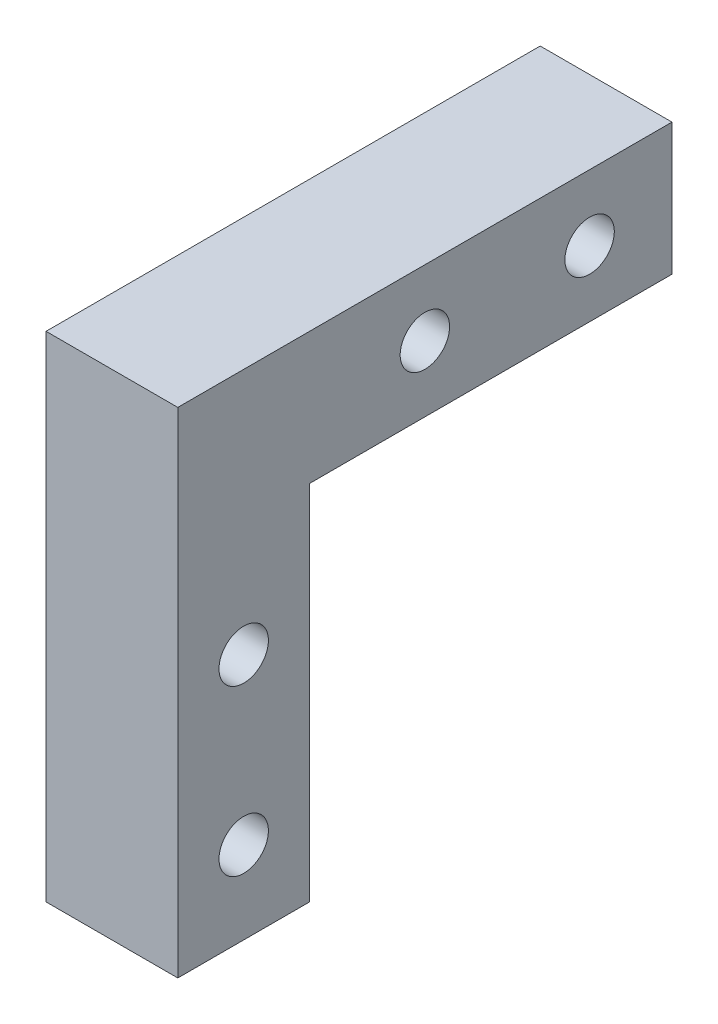
ISO-10303-21;
HEADER;
FILE_DESCRIPTION(('STEP AP214'),'2;1');
FILE_NAME('part.step','',(''),(''),'','','');
FILE_SCHEMA(('AUTOMOTIVE_DESIGN { 1 0 10303 214 1 1 1 1 }'));
ENDSEC;
DATA;
#1=APPLICATION_CONTEXT('core data for automotive mechanical design processes');
#2=APPLICATION_PROTOCOL_DEFINITION('international standard','automotive_design',2000,#1);
#3=PRODUCT_CONTEXT('',#1,'mechanical');
#4=PRODUCT('Part','Part','',(#3));
#5=PRODUCT_RELATED_PRODUCT_CATEGORY('part','',(#4));
#6=PRODUCT_DEFINITION_FORMATION('','',#4);
#7=PRODUCT_DEFINITION_CONTEXT('part definition',#1,'design');
#8=PRODUCT_DEFINITION('design','',#6,#7);
#9=PRODUCT_DEFINITION_SHAPE('','',#8);
#10=(LENGTH_UNIT() NAMED_UNIT(*) SI_UNIT(.MILLI.,.METRE.));
#11=(NAMED_UNIT(*) PLANE_ANGLE_UNIT() SI_UNIT($,.RADIAN.));
#12=(NAMED_UNIT(*) SI_UNIT($,.STERADIAN.) SOLID_ANGLE_UNIT());
#13=UNCERTAINTY_MEASURE_WITH_UNIT(LENGTH_MEASURE(1.E-05),#10,'distance_accuracy_value','');
#14=(GEOMETRIC_REPRESENTATION_CONTEXT(3) GLOBAL_UNCERTAINTY_ASSIGNED_CONTEXT((#13)) GLOBAL_UNIT_ASSIGNED_CONTEXT((#10,
#11,#12)) REPRESENTATION_CONTEXT('',''));
#15=CARTESIAN_POINT('',(0.,0.,0.));
#16=DIRECTION('',(0.,0.,1.));
#17=DIRECTION('',(1.,0.,0.));
#18=AXIS2_PLACEMENT_3D('',#15,#16,#17);
#19=CARTESIAN_POINT('',(8.,0.,-44.));
#20=DIRECTION('',(0.,1.,0.));
#21=DIRECTION('',(0.,0.,1.));
#22=AXIS2_PLACEMENT_3D('',#19,#20,#21);
#23=PLANE('',#22);
#24=DIRECTION('',(0.,0.,-1.));
#25=VECTOR('',#24,1.);
#26=CARTESIAN_POINT('',(-8.,0.,-44.));
#27=LINE('',#26,#25);
#28=CARTESIAN_POINT('',(-8.,0.,0.));
#29=VERTEX_POINT('',#28);
#30=CARTESIAN_POINT('',(-8.,0.,-44.));
#31=VERTEX_POINT('',#30);
#32=EDGE_CURVE('E119',#29,#31,#27,.T.);
#33=ORIENTED_EDGE('',*,*,#32,.T.);
#34=DIRECTION('',(-1.,0.,0.));
#35=VECTOR('',#34,1.);
#36=CARTESIAN_POINT('',(8.,0.,-44.));
#37=LINE('',#36,#35);
#38=CARTESIAN_POINT('',(8.,0.,-44.));
#39=VERTEX_POINT('',#38);
#40=EDGE_CURVE('E11',#39,#31,#37,.T.);
#41=ORIENTED_EDGE('',*,*,#40,.F.);
#42=DIRECTION('',(0.,0.,-1.));
#43=VECTOR('',#42,1.);
#44=CARTESIAN_POINT('',(8.,0.,-44.));
#45=LINE('',#44,#43);
#46=CARTESIAN_POINT('',(8.,0.,0.));
#47=VERTEX_POINT('',#46);
#48=EDGE_CURVE('E130',#47,#39,#45,.T.);
#49=ORIENTED_EDGE('',*,*,#48,.F.);
#50=DIRECTION('',(-1.,0.,0.));
#51=VECTOR('',#50,1.);
#52=CARTESIAN_POINT('',(8.,0.,0.));
#53=LINE('',#52,#51);
#54=EDGE_CURVE('E115',#47,#29,#53,.T.);
#55=ORIENTED_EDGE('',*,*,#54,.T.);
#56=EDGE_LOOP('',(#33,#41,#49,#55));
#57=FACE_BOUND('',#56,.T.);
#58=ADVANCED_FACE('F35',(#57),#23,.F.);
#59=CARTESIAN_POINT('',(8.,16.,-44.));
#60=DIRECTION('',(0.,0.,1.));
#61=DIRECTION('',(1.,0.,0.));
#62=AXIS2_PLACEMENT_3D('',#59,#60,#61);
#63=PLANE('',#62);
#64=DIRECTION('',(0.,1.,0.));
#65=VECTOR('',#64,1.);
#66=CARTESIAN_POINT('',(-8.,16.,-44.));
#67=LINE('',#66,#65);
#68=CARTESIAN_POINT('',(-8.,16.,-44.));
#69=VERTEX_POINT('',#68);
#70=EDGE_CURVE('E122',#31,#69,#67,.T.);
#71=ORIENTED_EDGE('',*,*,#70,.T.);
#72=DIRECTION('',(-1.,0.,0.));
#73=VECTOR('',#72,1.);
#74=CARTESIAN_POINT('',(8.,16.,-44.));
#75=LINE('',#74,#73);
#76=CARTESIAN_POINT('',(8.,16.,-44.));
#77=VERTEX_POINT('',#76);
#78=EDGE_CURVE('E43',#77,#69,#75,.T.);
#79=ORIENTED_EDGE('',*,*,#78,.F.);
#80=DIRECTION('',(0.,1.,0.));
#81=VECTOR('',#80,1.);
#82=CARTESIAN_POINT('',(8.,16.,-44.));
#83=LINE('',#82,#81);
#84=EDGE_CURVE('E88',#39,#77,#83,.T.);
#85=ORIENTED_EDGE('',*,*,#84,.F.);
#86=ORIENTED_EDGE('',*,*,#40,.T.);
#87=EDGE_LOOP('',(#71,#79,#85,#86));
#88=FACE_BOUND('',#87,.T.);
#89=ADVANCED_FACE('F156',(#88),#63,.F.);
#90=CARTESIAN_POINT('',(8.,16.,16.));
#91=DIRECTION('',(0.,-1.,0.));
#92=DIRECTION('',(0.,0.,-1.));
#93=AXIS2_PLACEMENT_3D('',#90,#91,#92);
#94=PLANE('',#93);
#95=DIRECTION('',(0.,0.,1.));
#96=VECTOR('',#95,1.);
#97=CARTESIAN_POINT('',(-8.,16.,16.));
#98=LINE('',#97,#96);
#99=CARTESIAN_POINT('',(-8.,16.,16.));
#100=VERTEX_POINT('',#99);
#101=EDGE_CURVE('E125',#69,#100,#98,.T.);
#102=ORIENTED_EDGE('',*,*,#101,.T.);
#103=DIRECTION('',(-1.,0.,0.));
#104=VECTOR('',#103,1.);
#105=CARTESIAN_POINT('',(8.,16.,16.));
#106=LINE('',#105,#104);
#107=CARTESIAN_POINT('',(8.,16.,16.));
#108=VERTEX_POINT('',#107);
#109=EDGE_CURVE('E110',#108,#100,#106,.T.);
#110=ORIENTED_EDGE('',*,*,#109,.F.);
#111=DIRECTION('',(0.,0.,1.));
#112=VECTOR('',#111,1.);
#113=CARTESIAN_POINT('',(8.,16.,16.));
#114=LINE('',#113,#112);
#115=EDGE_CURVE('E101',#77,#108,#114,.T.);
#116=ORIENTED_EDGE('',*,*,#115,.F.);
#117=ORIENTED_EDGE('',*,*,#78,.T.);
#118=EDGE_LOOP('',(#102,#110,#116,#117));
#119=FACE_BOUND('',#118,.T.);
#120=ADVANCED_FACE('F136',(#119),#94,.F.);
#121=CARTESIAN_POINT('',(8.,-44.,16.));
#122=DIRECTION('',(0.,0.,-1.));
#123=DIRECTION('',(-1.,0.,0.));
#124=AXIS2_PLACEMENT_3D('',#121,#122,#123);
#125=PLANE('',#124);
#126=DIRECTION('',(0.,-1.,0.));
#127=VECTOR('',#126,1.);
#128=CARTESIAN_POINT('',(-8.,-44.,16.));
#129=LINE('',#128,#127);
#130=CARTESIAN_POINT('',(-8.,-44.,16.));
#131=VERTEX_POINT('',#130);
#132=EDGE_CURVE('E109',#100,#131,#129,.T.);
#133=ORIENTED_EDGE('',*,*,#132,.T.);
#134=DIRECTION('',(-1.,0.,0.));
#135=VECTOR('',#134,1.);
#136=CARTESIAN_POINT('',(8.,-44.,16.));
#137=LINE('',#136,#135);
#138=CARTESIAN_POINT('',(8.,-44.,16.));
#139=VERTEX_POINT('',#138);
#140=EDGE_CURVE('E106',#139,#131,#137,.T.);
#141=ORIENTED_EDGE('',*,*,#140,.F.);
#142=DIRECTION('',(0.,-1.,0.));
#143=VECTOR('',#142,1.);
#144=CARTESIAN_POINT('',(8.,-44.,16.));
#145=LINE('',#144,#143);
#146=EDGE_CURVE('E95',#108,#139,#145,.T.);
#147=ORIENTED_EDGE('',*,*,#146,.F.);
#148=ORIENTED_EDGE('',*,*,#109,.T.);
#149=EDGE_LOOP('',(#133,#141,#147,#148));
#150=FACE_BOUND('',#149,.T.);
#151=ADVANCED_FACE('F107',(#150),#125,.F.);
#152=CARTESIAN_POINT('',(8.,-44.,0.));
#153=DIRECTION('',(0.,1.,0.));
#154=DIRECTION('',(0.,0.,1.));
#155=AXIS2_PLACEMENT_3D('',#152,#153,#154);
#156=PLANE('',#155);
#157=DIRECTION('',(0.,0.,-1.));
#158=VECTOR('',#157,1.);
#159=CARTESIAN_POINT('',(-8.,-44.,0.));
#160=LINE('',#159,#158);
#161=CARTESIAN_POINT('',(-8.,-44.,0.));
#162=VERTEX_POINT('',#161);
#163=EDGE_CURVE('E74',#131,#162,#160,.T.);
#164=ORIENTED_EDGE('',*,*,#163,.T.);
#165=DIRECTION('',(-1.,0.,0.));
#166=VECTOR('',#165,1.);
#167=CARTESIAN_POINT('',(8.,-44.,0.));
#168=LINE('',#167,#166);
#169=CARTESIAN_POINT('',(8.,-44.,0.));
#170=VERTEX_POINT('',#169);
#171=EDGE_CURVE('E111',#170,#162,#168,.T.);
#172=ORIENTED_EDGE('',*,*,#171,.F.);
#173=DIRECTION('',(0.,0.,-1.));
#174=VECTOR('',#173,1.);
#175=CARTESIAN_POINT('',(8.,-44.,0.));
#176=LINE('',#175,#174);
#177=EDGE_CURVE('E99',#139,#170,#176,.T.);
#178=ORIENTED_EDGE('',*,*,#177,.F.);
#179=ORIENTED_EDGE('',*,*,#140,.T.);
#180=EDGE_LOOP('',(#164,#172,#178,#179));
#181=FACE_BOUND('',#180,.T.);
#182=ADVANCED_FACE('F113',(#181),#156,.F.);
#183=CARTESIAN_POINT('',(8.,0.,0.));
#184=DIRECTION('',(0.,0.,1.));
#185=DIRECTION('',(0.,-1.,0.));
#186=AXIS2_PLACEMENT_3D('',#183,#184,#185);
#187=PLANE('',#186);
#188=DIRECTION('',(0.,1.,0.));
#189=VECTOR('',#188,1.);
#190=CARTESIAN_POINT('',(-8.,0.,0.));
#191=LINE('',#190,#189);
#192=EDGE_CURVE('E80',#162,#29,#191,.T.);
#193=ORIENTED_EDGE('',*,*,#192,.T.);
#194=ORIENTED_EDGE('',*,*,#54,.F.);
#195=DIRECTION('',(0.,1.,0.));
#196=VECTOR('',#195,1.);
#197=CARTESIAN_POINT('',(8.,0.,0.));
#198=LINE('',#197,#196);
#199=EDGE_CURVE('E51',#170,#47,#198,.T.);
#200=ORIENTED_EDGE('',*,*,#199,.F.);
#201=ORIENTED_EDGE('',*,*,#171,.T.);
#202=EDGE_LOOP('',(#193,#194,#200,#201));
#203=FACE_BOUND('',#202,.T.);
#204=ADVANCED_FACE('F143',(#203),#187,.F.);
#205=CARTESIAN_POINT('',(8.,0.,0.));
#206=DIRECTION('',(1.,0.,0.));
#207=DIRECTION('',(0.,0.,-1.));
#208=AXIS2_PLACEMENT_3D('',#205,#206,#207);
#209=PLANE('',#208);
#210=CARTESIAN_POINT('',(8.,8.00000000000001,-34.));
#211=DIRECTION('',(1.,0.,0.));
#212=DIRECTION('',(0.,0.,-1.));
#213=AXIS2_PLACEMENT_3D('',#210,#211,#212);
#214=CIRCLE('',#213,3.);
#215=CARTESIAN_POINT('',(8.,8.00000000000001,-37.));
#216=VERTEX_POINT('',#215);
#217=EDGE_CURVE('E237',#216,#216,#214,.T.);
#218=ORIENTED_EDGE('',*,*,#217,.F.);
#219=EDGE_LOOP('',(#218));
#220=FACE_BOUND('',#219,.T.);
#221=CARTESIAN_POINT('',(8.,8.,-14.));
#222=DIRECTION('',(1.,0.,0.));
#223=DIRECTION('',(0.,0.,-1.));
#224=AXIS2_PLACEMENT_3D('',#221,#222,#223);
#225=CIRCLE('',#224,3.);
#226=CARTESIAN_POINT('',(8.,8.,-17.));
#227=VERTEX_POINT('',#226);
#228=EDGE_CURVE('E239',#227,#227,#225,.T.);
#229=ORIENTED_EDGE('',*,*,#228,.F.);
#230=EDGE_LOOP('',(#229));
#231=FACE_BOUND('',#230,.T.);
#232=CARTESIAN_POINT('',(8.,-14.,8.));
#233=DIRECTION('',(1.,0.,0.));
#234=DIRECTION('',(0.,0.,-1.));
#235=AXIS2_PLACEMENT_3D('',#232,#233,#234);
#236=CIRCLE('',#235,3.);
#237=CARTESIAN_POINT('',(8.,-14.,5.));
#238=VERTEX_POINT('',#237);
#239=EDGE_CURVE('E245',#238,#238,#236,.T.);
#240=ORIENTED_EDGE('',*,*,#239,.F.);
#241=EDGE_LOOP('',(#240));
#242=FACE_BOUND('',#241,.T.);
#243=CARTESIAN_POINT('',(8.,-34.,8.));
#244=DIRECTION('',(1.,0.,0.));
#245=DIRECTION('',(0.,0.,-1.));
#246=AXIS2_PLACEMENT_3D('',#243,#244,#245);
#247=CIRCLE('',#246,3.);
#248=CARTESIAN_POINT('',(8.,-34.,4.99999999999999));
#249=VERTEX_POINT('',#248);
#250=EDGE_CURVE('E251',#249,#249,#247,.T.);
#251=ORIENTED_EDGE('',*,*,#250,.F.);
#252=EDGE_LOOP('',(#251));
#253=FACE_BOUND('',#252,.T.);
#254=ORIENTED_EDGE('',*,*,#48,.T.);
#255=ORIENTED_EDGE('',*,*,#84,.T.);
#256=ORIENTED_EDGE('',*,*,#115,.T.);
#257=ORIENTED_EDGE('',*,*,#146,.T.);
#258=ORIENTED_EDGE('',*,*,#177,.T.);
#259=ORIENTED_EDGE('',*,*,#199,.T.);
#260=EDGE_LOOP('',(#254,#255,#256,#257,#258,#259));
#261=FACE_BOUND('',#260,.T.);
#262=ADVANCED_FACE('F97',(#220,#231,#242,#253,#261),#209,.T.);
#263=CARTESIAN_POINT('',(-8.,0.,0.));
#264=DIRECTION('',(1.,0.,0.));
#265=DIRECTION('',(0.,0.,-1.));
#266=AXIS2_PLACEMENT_3D('',#263,#264,#265);
#267=PLANE('',#266);
#268=CARTESIAN_POINT('',(-8.,8.00000000000001,-34.));
#269=DIRECTION('',(1.,0.,0.));
#270=DIRECTION('',(0.,0.,-1.));
#271=AXIS2_PLACEMENT_3D('',#268,#269,#270);
#272=CIRCLE('',#271,3.);
#273=CARTESIAN_POINT('',(-8.,8.00000000000001,-37.));
#274=VERTEX_POINT('',#273);
#275=EDGE_CURVE('E234',#274,#274,#272,.T.);
#276=ORIENTED_EDGE('',*,*,#275,.T.);
#277=EDGE_LOOP('',(#276));
#278=FACE_BOUND('',#277,.T.);
#279=CARTESIAN_POINT('',(-8.,8.,-14.));
#280=DIRECTION('',(1.,0.,0.));
#281=DIRECTION('',(0.,0.,-1.));
#282=AXIS2_PLACEMENT_3D('',#279,#280,#281);
#283=CIRCLE('',#282,3.);
#284=CARTESIAN_POINT('',(-8.,8.,-17.));
#285=VERTEX_POINT('',#284);
#286=EDGE_CURVE('E242',#285,#285,#283,.T.);
#287=ORIENTED_EDGE('',*,*,#286,.T.);
#288=EDGE_LOOP('',(#287));
#289=FACE_BOUND('',#288,.T.);
#290=CARTESIAN_POINT('',(-8.,-14.,8.));
#291=DIRECTION('',(1.,0.,0.));
#292=DIRECTION('',(0.,0.,-1.));
#293=AXIS2_PLACEMENT_3D('',#290,#291,#292);
#294=CIRCLE('',#293,3.);
#295=CARTESIAN_POINT('',(-8.,-14.,5.));
#296=VERTEX_POINT('',#295);
#297=EDGE_CURVE('E248',#296,#296,#294,.T.);
#298=ORIENTED_EDGE('',*,*,#297,.T.);
#299=EDGE_LOOP('',(#298));
#300=FACE_BOUND('',#299,.T.);
#301=CARTESIAN_POINT('',(-8.,-34.,8.));
#302=DIRECTION('',(1.,0.,0.));
#303=DIRECTION('',(0.,0.,-1.));
#304=AXIS2_PLACEMENT_3D('',#301,#302,#303);
#305=CIRCLE('',#304,3.);
#306=CARTESIAN_POINT('',(-8.,-34.,4.99999999999999));
#307=VERTEX_POINT('',#306);
#308=EDGE_CURVE('E123',#307,#307,#305,.T.);
#309=ORIENTED_EDGE('',*,*,#308,.T.);
#310=EDGE_LOOP('',(#309));
#311=FACE_BOUND('',#310,.T.);
#312=ORIENTED_EDGE('',*,*,#32,.F.);
#313=ORIENTED_EDGE('',*,*,#192,.F.);
#314=ORIENTED_EDGE('',*,*,#163,.F.);
#315=ORIENTED_EDGE('',*,*,#132,.F.);
#316=ORIENTED_EDGE('',*,*,#101,.F.);
#317=ORIENTED_EDGE('',*,*,#70,.F.);
#318=EDGE_LOOP('',(#312,#313,#314,#315,#316,#317));
#319=FACE_BOUND('',#318,.T.);
#320=ADVANCED_FACE('F139',(#278,#289,#300,#311,#319),#267,.F.);
#321=CARTESIAN_POINT('',(-8.,-34.,8.));
#322=DIRECTION('',(1.,0.,0.));
#323=DIRECTION('',(0.,0.,-1.));
#324=AXIS2_PLACEMENT_3D('',#321,#322,#323);
#325=CYLINDRICAL_SURFACE('',#324,3.);
#326=ORIENTED_EDGE('',*,*,#308,.F.);
#327=EDGE_LOOP('',(#326));
#328=FACE_BOUND('',#327,.T.);
#329=ORIENTED_EDGE('',*,*,#250,.T.);
#330=EDGE_LOOP('',(#329));
#331=FACE_BOUND('',#330,.T.);
#332=ADVANCED_FACE('F189',(#328,#331),#325,.F.);
#333=CARTESIAN_POINT('',(-8.,-14.,8.));
#334=DIRECTION('',(1.,0.,0.));
#335=DIRECTION('',(0.,0.,-1.));
#336=AXIS2_PLACEMENT_3D('',#333,#334,#335);
#337=CYLINDRICAL_SURFACE('',#336,3.);
#338=ORIENTED_EDGE('',*,*,#297,.F.);
#339=EDGE_LOOP('',(#338));
#340=FACE_BOUND('',#339,.T.);
#341=ORIENTED_EDGE('',*,*,#239,.T.);
#342=EDGE_LOOP('',(#341));
#343=FACE_BOUND('',#342,.T.);
#344=ADVANCED_FACE('F197',(#340,#343),#337,.F.);
#345=CARTESIAN_POINT('',(-8.,8.,-14.));
#346=DIRECTION('',(1.,0.,0.));
#347=DIRECTION('',(0.,0.,-1.));
#348=AXIS2_PLACEMENT_3D('',#345,#346,#347);
#349=CYLINDRICAL_SURFACE('',#348,3.);
#350=ORIENTED_EDGE('',*,*,#286,.F.);
#351=EDGE_LOOP('',(#350));
#352=FACE_BOUND('',#351,.T.);
#353=ORIENTED_EDGE('',*,*,#228,.T.);
#354=EDGE_LOOP('',(#353));
#355=FACE_BOUND('',#354,.T.);
#356=ADVANCED_FACE('F207',(#352,#355),#349,.F.);
#357=CARTESIAN_POINT('',(-8.,8.00000000000001,-34.));
#358=DIRECTION('',(1.,0.,0.));
#359=DIRECTION('',(0.,0.,-1.));
#360=AXIS2_PLACEMENT_3D('',#357,#358,#359);
#361=CYLINDRICAL_SURFACE('',#360,3.);
#362=ORIENTED_EDGE('',*,*,#275,.F.);
#363=EDGE_LOOP('',(#362));
#364=FACE_BOUND('',#363,.T.);
#365=ORIENTED_EDGE('',*,*,#217,.T.);
#366=EDGE_LOOP('',(#365));
#367=FACE_BOUND('',#366,.T.);
#368=ADVANCED_FACE('F217',(#364,#367),#361,.F.);
#369=CLOSED_SHELL('',(#58,#89,#120,#151,#182,#204,#262,#320,#332,#344,#356,#368));
#370=MANIFOLD_SOLID_BREP('B2',#369);
#371=ADVANCED_BREP_SHAPE_REPRESENTATION('',(#18,#370),#14);
#372=SHAPE_DEFINITION_REPRESENTATION(#9,#371);
ENDSEC;
END-ISO-10303-21;
